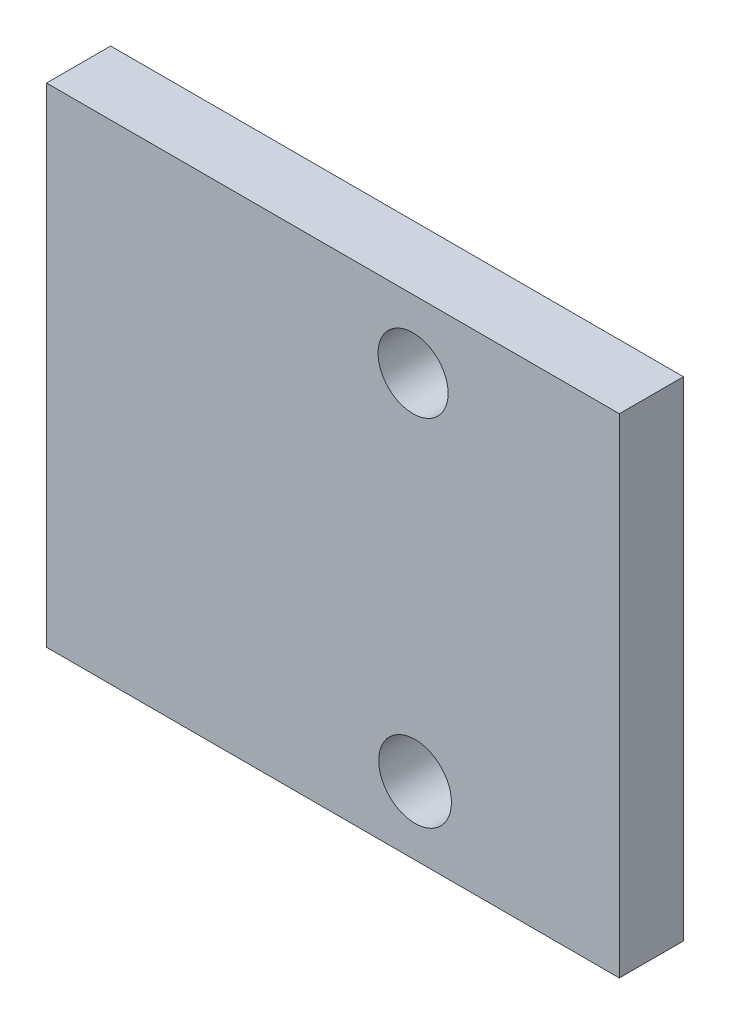
ISO-10303-21;
HEADER;
FILE_DESCRIPTION(('STEP AP214'),'2;1');
FILE_NAME('part.step','',(''),(''),'','','');
FILE_SCHEMA(('AUTOMOTIVE_DESIGN { 1 0 10303 214 1 1 1 1 }'));
ENDSEC;
DATA;
#1=APPLICATION_CONTEXT('core data for automotive mechanical design processes');
#2=APPLICATION_PROTOCOL_DEFINITION('international standard','automotive_design',2000,#1);
#3=PRODUCT_CONTEXT('',#1,'mechanical');
#4=PRODUCT('Part','Part','',(#3));
#5=PRODUCT_RELATED_PRODUCT_CATEGORY('part','',(#4));
#6=PRODUCT_DEFINITION_FORMATION('','',#4);
#7=PRODUCT_DEFINITION_CONTEXT('part definition',#1,'design');
#8=PRODUCT_DEFINITION('design','',#6,#7);
#9=PRODUCT_DEFINITION_SHAPE('','',#8);
#10=(LENGTH_UNIT() NAMED_UNIT(*) SI_UNIT(.MILLI.,.METRE.));
#11=(NAMED_UNIT(*) PLANE_ANGLE_UNIT() SI_UNIT($,.RADIAN.));
#12=(NAMED_UNIT(*) SI_UNIT($,.STERADIAN.) SOLID_ANGLE_UNIT());
#13=UNCERTAINTY_MEASURE_WITH_UNIT(LENGTH_MEASURE(1.E-05),#10,'distance_accuracy_value','');
#14=(GEOMETRIC_REPRESENTATION_CONTEXT(3) GLOBAL_UNCERTAINTY_ASSIGNED_CONTEXT((#13)) GLOBAL_UNIT_ASSIGNED_CONTEXT((#10,
#11,#12)) REPRESENTATION_CONTEXT('',''));
#15=CARTESIAN_POINT('',(0.,0.,0.));
#16=DIRECTION('',(0.,0.,1.));
#17=DIRECTION('',(1.,0.,0.));
#18=AXIS2_PLACEMENT_3D('',#15,#16,#17);
#19=CARTESIAN_POINT('',(0.,0.,1.6));
#20=DIRECTION('',(0.,0.,-1.));
#21=DIRECTION('',(-1.,0.,0.));
#22=AXIS2_PLACEMENT_3D('',#19,#20,#21);
#23=PLANE('',#22);
#24=DIRECTION('',(0.,1.,0.));
#25=VECTOR('',#24,1.);
#26=CARTESIAN_POINT('',(7.15,-6.1,1.6));
#27=LINE('',#26,#25);
#28=CARTESIAN_POINT('',(7.15,-6.1,1.6));
#29=VERTEX_POINT('',#28);
#30=CARTESIAN_POINT('',(7.15,6.1,1.6));
#31=VERTEX_POINT('',#30);
#32=EDGE_CURVE('E142',#29,#31,#27,.T.);
#33=ORIENTED_EDGE('',*,*,#32,.T.);
#34=DIRECTION('',(-1.,0.,0.));
#35=VECTOR('',#34,1.);
#36=CARTESIAN_POINT('',(-7.15,6.1,1.6));
#37=LINE('',#36,#35);
#38=CARTESIAN_POINT('',(-7.15,6.1,1.6));
#39=VERTEX_POINT('',#38);
#40=EDGE_CURVE('E145',#31,#39,#37,.T.);
#41=ORIENTED_EDGE('',*,*,#40,.T.);
#42=DIRECTION('',(0.,-1.,0.));
#43=VECTOR('',#42,1.);
#44=CARTESIAN_POINT('',(-7.15,-6.1,1.6));
#45=LINE('',#44,#43);
#46=CARTESIAN_POINT('',(-7.15,-6.1,1.6));
#47=VERTEX_POINT('',#46);
#48=EDGE_CURVE('E148',#39,#47,#45,.T.);
#49=ORIENTED_EDGE('',*,*,#48,.T.);
#50=DIRECTION('',(1.,0.,0.));
#51=VECTOR('',#50,1.);
#52=CARTESIAN_POINT('',(-7.15,-6.1,1.6));
#53=LINE('',#52,#51);
#54=EDGE_CURVE('E150',#47,#29,#53,.T.);
#55=ORIENTED_EDGE('',*,*,#54,.T.);
#56=EDGE_LOOP('',(#33,#41,#49,#55));
#57=FACE_BOUND('',#56,.T.);
#58=CARTESIAN_POINT('',(2.,4.39985795339902,1.6));
#59=DIRECTION('',(0.,0.,1.));
#60=DIRECTION('',(1.,0.,0.));
#61=AXIS2_PLACEMENT_3D('',#58,#59,#60);
#62=CIRCLE('',#61,0.875);
#63=CARTESIAN_POINT('',(2.875,4.39985795339902,1.6));
#64=VERTEX_POINT('',#63);
#65=EDGE_CURVE('E136',#64,#64,#62,.T.);
#66=ORIENTED_EDGE('',*,*,#65,.F.);
#67=EDGE_LOOP('',(#66));
#68=FACE_BOUND('',#67,.T.);
#69=CARTESIAN_POINT('',(2.05,-4.4,1.6));
#70=DIRECTION('',(0.,0.,1.));
#71=DIRECTION('',(1.,0.,0.));
#72=AXIS2_PLACEMENT_3D('',#69,#70,#71);
#73=CIRCLE('',#72,0.90790271907019);
#74=CARTESIAN_POINT('',(2.95790271907019,-4.4,1.6));
#75=VERTEX_POINT('',#74);
#76=EDGE_CURVE('E127',#75,#75,#73,.T.);
#77=ORIENTED_EDGE('',*,*,#76,.F.);
#78=EDGE_LOOP('',(#77));
#79=FACE_BOUND('',#78,.T.);
#80=ADVANCED_FACE('F39',(#57,#68,#79),#23,.F.);
#81=CARTESIAN_POINT('',(0.,0.,0.));
#82=DIRECTION('',(0.,0.,-1.));
#83=DIRECTION('',(-1.,0.,0.));
#84=AXIS2_PLACEMENT_3D('',#81,#82,#83);
#85=PLANE('',#84);
#86=DIRECTION('',(0.,1.,0.));
#87=VECTOR('',#86,1.);
#88=CARTESIAN_POINT('',(-2.50020623086665,-2.50020623086665,0.));
#89=LINE('',#88,#87);
#90=CARTESIAN_POINT('',(-2.50020623086665,-2.50020623086665,0.));
#91=VERTEX_POINT('',#90);
#92=CARTESIAN_POINT('',(-2.50020623086665,2.50020623086665,0.));
#93=VERTEX_POINT('',#92);
#94=EDGE_CURVE('E54',#91,#93,#89,.T.);
#95=ORIENTED_EDGE('',*,*,#94,.F.);
#96=DIRECTION('',(-1.,0.,0.));
#97=VECTOR('',#96,1.);
#98=CARTESIAN_POINT('',(2.50020623086665,-2.50020623086665,0.));
#99=LINE('',#98,#97);
#100=CARTESIAN_POINT('',(2.50020623086665,-2.50020623086665,0.));
#101=VERTEX_POINT('',#100);
#102=EDGE_CURVE('E58',#101,#91,#99,.T.);
#103=ORIENTED_EDGE('',*,*,#102,.F.);
#104=DIRECTION('',(0.,-1.,0.));
#105=VECTOR('',#104,1.);
#106=CARTESIAN_POINT('',(2.50020623086665,-2.50020623086665,0.));
#107=LINE('',#106,#105);
#108=CARTESIAN_POINT('',(2.50020623086665,2.50020623086665,0.));
#109=VERTEX_POINT('',#108);
#110=EDGE_CURVE('E308',#109,#101,#107,.T.);
#111=ORIENTED_EDGE('',*,*,#110,.F.);
#112=DIRECTION('',(1.,0.,0.));
#113=VECTOR('',#112,1.);
#114=CARTESIAN_POINT('',(2.50020623086665,2.50020623086665,0.));
#115=LINE('',#114,#113);
#116=EDGE_CURVE('E314',#93,#109,#115,.T.);
#117=ORIENTED_EDGE('',*,*,#116,.F.);
#118=EDGE_LOOP('',(#95,#103,#111,#117));
#119=FACE_BOUND('',#118,.T.);
#120=CARTESIAN_POINT('',(2.,4.39985795339902,0.));
#121=DIRECTION('',(0.,0.,1.));
#122=DIRECTION('',(1.,0.,0.));
#123=AXIS2_PLACEMENT_3D('',#120,#121,#122);
#124=CIRCLE('',#123,0.875);
#125=CARTESIAN_POINT('',(2.875,4.39985795339902,0.));
#126=VERTEX_POINT('',#125);
#127=EDGE_CURVE('E134',#126,#126,#124,.T.);
#128=ORIENTED_EDGE('',*,*,#127,.T.);
#129=EDGE_LOOP('',(#128));
#130=FACE_BOUND('',#129,.T.);
#131=DIRECTION('',(0.,1.,0.));
#132=VECTOR('',#131,1.);
#133=CARTESIAN_POINT('',(7.15,-6.1,0.));
#134=LINE('',#133,#132);
#135=CARTESIAN_POINT('',(7.15,-6.1,0.));
#136=VERTEX_POINT('',#135);
#137=CARTESIAN_POINT('',(7.15,6.1,0.));
#138=VERTEX_POINT('',#137);
#139=EDGE_CURVE('E139',#136,#138,#134,.T.);
#140=ORIENTED_EDGE('',*,*,#139,.F.);
#141=DIRECTION('',(1.,0.,0.));
#142=VECTOR('',#141,1.);
#143=CARTESIAN_POINT('',(-7.15,-6.1,0.));
#144=LINE('',#143,#142);
#145=CARTESIAN_POINT('',(-7.15,-6.1,0.));
#146=VERTEX_POINT('',#145);
#147=EDGE_CURVE('E146',#146,#136,#144,.T.);
#148=ORIENTED_EDGE('',*,*,#147,.F.);
#149=DIRECTION('',(0.,-1.,0.));
#150=VECTOR('',#149,1.);
#151=CARTESIAN_POINT('',(-7.15,-6.1,0.));
#152=LINE('',#151,#150);
#153=CARTESIAN_POINT('',(-7.15,6.1,0.));
#154=VERTEX_POINT('',#153);
#155=EDGE_CURVE('E157',#154,#146,#152,.T.);
#156=ORIENTED_EDGE('',*,*,#155,.F.);
#157=DIRECTION('',(-1.,0.,0.));
#158=VECTOR('',#157,1.);
#159=CARTESIAN_POINT('',(-7.15,6.1,0.));
#160=LINE('',#159,#158);
#161=EDGE_CURVE('E155',#138,#154,#160,.T.);
#162=ORIENTED_EDGE('',*,*,#161,.F.);
#163=EDGE_LOOP('',(#140,#148,#156,#162));
#164=FACE_BOUND('',#163,.T.);
#165=CARTESIAN_POINT('',(2.05,-4.4,0.));
#166=DIRECTION('',(0.,0.,1.));
#167=DIRECTION('',(1.,0.,0.));
#168=AXIS2_PLACEMENT_3D('',#165,#166,#167);
#169=CIRCLE('',#168,0.90790271907019);
#170=CARTESIAN_POINT('',(2.95790271907019,-4.4,0.));
#171=VERTEX_POINT('',#170);
#172=EDGE_CURVE('E124',#171,#171,#169,.T.);
#173=ORIENTED_EDGE('',*,*,#172,.T.);
#174=EDGE_LOOP('',(#173));
#175=FACE_BOUND('',#174,.T.);
#176=ADVANCED_FACE('F175',(#119,#130,#164,#175),#85,.T.);
#177=CARTESIAN_POINT('',(7.15,-6.1,1.6));
#178=DIRECTION('',(-1.,0.,0.));
#179=DIRECTION('',(0.,0.,1.));
#180=AXIS2_PLACEMENT_3D('',#177,#178,#179);
#181=PLANE('',#180);
#182=ORIENTED_EDGE('',*,*,#139,.T.);
#183=DIRECTION('',(0.,0.,-1.));
#184=VECTOR('',#183,1.);
#185=CARTESIAN_POINT('',(7.15,6.1,1.6));
#186=LINE('',#185,#184);
#187=EDGE_CURVE('E11',#31,#138,#186,.T.);
#188=ORIENTED_EDGE('',*,*,#187,.F.);
#189=ORIENTED_EDGE('',*,*,#32,.F.);
#190=DIRECTION('',(0.,0.,-1.));
#191=VECTOR('',#190,1.);
#192=CARTESIAN_POINT('',(7.15,-6.1,1.6));
#193=LINE('',#192,#191);
#194=EDGE_CURVE('E152',#29,#136,#193,.T.);
#195=ORIENTED_EDGE('',*,*,#194,.T.);
#196=EDGE_LOOP('',(#182,#188,#189,#195));
#197=FACE_BOUND('',#196,.T.);
#198=ADVANCED_FACE('F41',(#197),#181,.F.);
#199=CARTESIAN_POINT('',(-7.15,6.1,1.6));
#200=DIRECTION('',(0.,-1.,0.));
#201=DIRECTION('',(0.,0.,-1.));
#202=AXIS2_PLACEMENT_3D('',#199,#200,#201);
#203=PLANE('',#202);
#204=ORIENTED_EDGE('',*,*,#161,.T.);
#205=DIRECTION('',(0.,0.,-1.));
#206=VECTOR('',#205,1.);
#207=CARTESIAN_POINT('',(-7.15,6.1,1.6));
#208=LINE('',#207,#206);
#209=EDGE_CURVE('E47',#39,#154,#208,.T.);
#210=ORIENTED_EDGE('',*,*,#209,.F.);
#211=ORIENTED_EDGE('',*,*,#40,.F.);
#212=ORIENTED_EDGE('',*,*,#187,.T.);
#213=EDGE_LOOP('',(#204,#210,#211,#212));
#214=FACE_BOUND('',#213,.T.);
#215=ADVANCED_FACE('F186',(#214),#203,.F.);
#216=CARTESIAN_POINT('',(-7.15,-6.1,1.6));
#217=DIRECTION('',(1.,0.,0.));
#218=DIRECTION('',(0.,0.,-1.));
#219=AXIS2_PLACEMENT_3D('',#216,#217,#218);
#220=PLANE('',#219);
#221=ORIENTED_EDGE('',*,*,#155,.T.);
#222=DIRECTION('',(0.,0.,-1.));
#223=VECTOR('',#222,1.);
#224=CARTESIAN_POINT('',(-7.15,-6.1,1.6));
#225=LINE('',#224,#223);
#226=EDGE_CURVE('E162',#47,#146,#225,.T.);
#227=ORIENTED_EDGE('',*,*,#226,.F.);
#228=ORIENTED_EDGE('',*,*,#48,.F.);
#229=ORIENTED_EDGE('',*,*,#209,.T.);
#230=EDGE_LOOP('',(#221,#227,#228,#229));
#231=FACE_BOUND('',#230,.T.);
#232=ADVANCED_FACE('F169',(#231),#220,.F.);
#233=CARTESIAN_POINT('',(-7.15,-6.1,1.6));
#234=DIRECTION('',(0.,1.,0.));
#235=DIRECTION('',(0.,0.,1.));
#236=AXIS2_PLACEMENT_3D('',#233,#234,#235);
#237=PLANE('',#236);
#238=ORIENTED_EDGE('',*,*,#147,.T.);
#239=ORIENTED_EDGE('',*,*,#194,.F.);
#240=ORIENTED_EDGE('',*,*,#54,.F.);
#241=ORIENTED_EDGE('',*,*,#226,.T.);
#242=EDGE_LOOP('',(#238,#239,#240,#241));
#243=FACE_BOUND('',#242,.T.);
#244=ADVANCED_FACE('F179',(#243),#237,.F.);
#245=CARTESIAN_POINT('',(2.,4.39985795339902,1.6));
#246=DIRECTION('',(0.,0.,-1.));
#247=DIRECTION('',(-1.,0.,0.));
#248=AXIS2_PLACEMENT_3D('',#245,#246,#247);
#249=CYLINDRICAL_SURFACE('',#248,0.875);
#250=ORIENTED_EDGE('',*,*,#65,.T.);
#251=EDGE_LOOP('',(#250));
#252=FACE_BOUND('',#251,.T.);
#253=ORIENTED_EDGE('',*,*,#127,.F.);
#254=EDGE_LOOP('',(#253));
#255=FACE_BOUND('',#254,.T.);
#256=ADVANCED_FACE('F200',(#252,#255),#249,.F.);
#257=CARTESIAN_POINT('',(2.05,-4.4,1.6));
#258=DIRECTION('',(0.,0.,-1.));
#259=DIRECTION('',(-1.,0.,0.));
#260=AXIS2_PLACEMENT_3D('',#257,#258,#259);
#261=CYLINDRICAL_SURFACE('',#260,0.90790271907019);
#262=ORIENTED_EDGE('',*,*,#76,.T.);
#263=EDGE_LOOP('',(#262));
#264=FACE_BOUND('',#263,.T.);
#265=ORIENTED_EDGE('',*,*,#172,.F.);
#266=EDGE_LOOP('',(#265));
#267=FACE_BOUND('',#266,.T.);
#268=ADVANCED_FACE('F207',(#264,#267),#261,.F.);
#269=CARTESIAN_POINT('',(-2.50020623086665,-2.50020623086665,-1.6));
#270=DIRECTION('',(1.,0.,0.));
#271=DIRECTION('',(0.,0.,-1.));
#272=AXIS2_PLACEMENT_3D('',#269,#270,#271);
#273=PLANE('',#272);
#274=ORIENTED_EDGE('',*,*,#94,.T.);
#275=DIRECTION('',(0.,0.,1.));
#276=VECTOR('',#275,1.);
#277=CARTESIAN_POINT('',(-2.50020623086665,2.50020623086665,-1.6));
#278=LINE('',#277,#276);
#279=CARTESIAN_POINT('',(-2.50020623086665,2.50020623086665,-1.6));
#280=VERTEX_POINT('',#279);
#281=EDGE_CURVE('E107',#280,#93,#278,.T.);
#282=ORIENTED_EDGE('',*,*,#281,.F.);
#283=DIRECTION('',(0.,1.,0.));
#284=VECTOR('',#283,1.);
#285=CARTESIAN_POINT('',(-2.50020623086665,-2.50020623086665,-1.6));
#286=LINE('',#285,#284);
#287=CARTESIAN_POINT('',(-2.50020623086665,-2.50020623086665,-1.6));
#288=VERTEX_POINT('',#287);
#289=EDGE_CURVE('E113',#288,#280,#286,.T.);
#290=ORIENTED_EDGE('',*,*,#289,.F.);
#291=DIRECTION('',(0.,0.,1.));
#292=VECTOR('',#291,1.);
#293=CARTESIAN_POINT('',(-2.50020623086665,-2.50020623086665,-1.6));
#294=LINE('',#293,#292);
#295=EDGE_CURVE('E306',#288,#91,#294,.T.);
#296=ORIENTED_EDGE('',*,*,#295,.T.);
#297=EDGE_LOOP('',(#274,#282,#290,#296));
#298=FACE_BOUND('',#297,.T.);
#299=ADVANCED_FACE('F123',(#298),#273,.F.);
#300=CARTESIAN_POINT('',(2.50020623086665,2.50020623086665,-1.6));
#301=DIRECTION('',(0.,-1.,0.));
#302=DIRECTION('',(0.,0.,-1.));
#303=AXIS2_PLACEMENT_3D('',#300,#301,#302);
#304=PLANE('',#303);
#305=ORIENTED_EDGE('',*,*,#116,.T.);
#306=DIRECTION('',(0.,0.,1.));
#307=VECTOR('',#306,1.);
#308=CARTESIAN_POINT('',(2.50020623086665,2.50020623086665,-1.6));
#309=LINE('',#308,#307);
#310=CARTESIAN_POINT('',(2.50020623086665,2.50020623086665,-1.6));
#311=VERTEX_POINT('',#310);
#312=EDGE_CURVE('E109',#311,#109,#309,.T.);
#313=ORIENTED_EDGE('',*,*,#312,.F.);
#314=DIRECTION('',(1.,0.,0.));
#315=VECTOR('',#314,1.);
#316=CARTESIAN_POINT('',(2.50020623086665,2.50020623086665,-1.6));
#317=LINE('',#316,#315);
#318=EDGE_CURVE('E102',#280,#311,#317,.T.);
#319=ORIENTED_EDGE('',*,*,#318,.F.);
#320=ORIENTED_EDGE('',*,*,#281,.T.);
#321=EDGE_LOOP('',(#305,#313,#319,#320));
#322=FACE_BOUND('',#321,.T.);
#323=ADVANCED_FACE('F105',(#322),#304,.F.);
#324=CARTESIAN_POINT('',(2.50020623086665,-2.50020623086665,-1.6));
#325=DIRECTION('',(-1.,0.,0.));
#326=DIRECTION('',(0.,0.,1.));
#327=AXIS2_PLACEMENT_3D('',#324,#325,#326);
#328=PLANE('',#327);
#329=ORIENTED_EDGE('',*,*,#110,.T.);
#330=DIRECTION('',(0.,0.,1.));
#331=VECTOR('',#330,1.);
#332=CARTESIAN_POINT('',(2.50020623086665,-2.50020623086665,-1.6));
#333=LINE('',#332,#331);
#334=CARTESIAN_POINT('',(2.50020623086665,-2.50020623086665,-1.6));
#335=VERTEX_POINT('',#334);
#336=EDGE_CURVE('E129',#335,#101,#333,.T.);
#337=ORIENTED_EDGE('',*,*,#336,.F.);
#338=DIRECTION('',(0.,-1.,0.));
#339=VECTOR('',#338,1.);
#340=CARTESIAN_POINT('',(2.50020623086665,-2.50020623086665,-1.6));
#341=LINE('',#340,#339);
#342=EDGE_CURVE('E112',#311,#335,#341,.T.);
#343=ORIENTED_EDGE('',*,*,#342,.F.);
#344=ORIENTED_EDGE('',*,*,#312,.T.);
#345=EDGE_LOOP('',(#329,#337,#343,#344));
#346=FACE_BOUND('',#345,.T.);
#347=ADVANCED_FACE('F228',(#346),#328,.F.);
#348=CARTESIAN_POINT('',(2.50020623086665,-2.50020623086665,-1.6));
#349=DIRECTION('',(0.,1.,0.));
#350=DIRECTION('',(0.,0.,1.));
#351=AXIS2_PLACEMENT_3D('',#348,#349,#350);
#352=PLANE('',#351);
#353=ORIENTED_EDGE('',*,*,#102,.T.);
#354=ORIENTED_EDGE('',*,*,#295,.F.);
#355=DIRECTION('',(-1.,0.,0.));
#356=VECTOR('',#355,1.);
#357=CARTESIAN_POINT('',(2.50020623086665,-2.50020623086665,-1.6));
#358=LINE('',#357,#356);
#359=EDGE_CURVE('E118',#335,#288,#358,.T.);
#360=ORIENTED_EDGE('',*,*,#359,.F.);
#361=ORIENTED_EDGE('',*,*,#336,.T.);
#362=EDGE_LOOP('',(#353,#354,#360,#361));
#363=FACE_BOUND('',#362,.T.);
#364=ADVANCED_FACE('F231',(#363),#352,.F.);
#365=CARTESIAN_POINT('',(0.,0.,-1.6));
#366=DIRECTION('',(0.,0.,1.));
#367=DIRECTION('',(1.,0.,0.));
#368=AXIS2_PLACEMENT_3D('',#365,#366,#367);
#369=PLANE('',#368);
#370=ORIENTED_EDGE('',*,*,#289,.T.);
#371=ORIENTED_EDGE('',*,*,#318,.T.);
#372=ORIENTED_EDGE('',*,*,#342,.T.);
#373=ORIENTED_EDGE('',*,*,#359,.T.);
#374=EDGE_LOOP('',(#370,#371,#372,#373));
#375=FACE_BOUND('',#374,.T.);
#376=ADVANCED_FACE('F116',(#375),#369,.F.);
#377=CLOSED_SHELL('',(#80,#176,#198,#215,#232,#244,#256,#268,#299,#323,#347,#364,#376));
#378=MANIFOLD_SOLID_BREP('B2',#377);
#379=ADVANCED_BREP_SHAPE_REPRESENTATION('',(#18,#378),#14);
#380=SHAPE_DEFINITION_REPRESENTATION(#9,#379);
ENDSEC;
END-ISO-10303-21;
